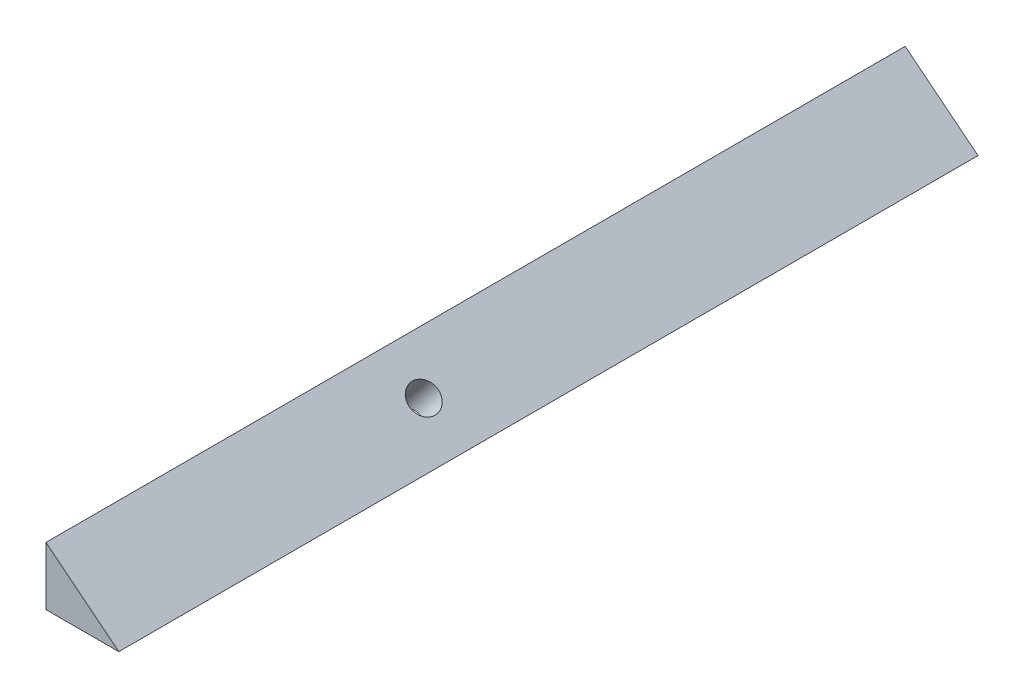
ISO-10303-21;
HEADER;
FILE_DESCRIPTION(('STEP AP214'),'2;1');
FILE_NAME('part.step','',(''),(''),'','','');
FILE_SCHEMA(('AUTOMOTIVE_DESIGN { 1 0 10303 214 1 1 1 1 }'));
ENDSEC;
DATA;
#1=APPLICATION_CONTEXT('core data for automotive mechanical design processes');
#2=APPLICATION_PROTOCOL_DEFINITION('international standard','automotive_design',2000,#1);
#3=PRODUCT_CONTEXT('',#1,'mechanical');
#4=PRODUCT('Part','Part','',(#3));
#5=PRODUCT_RELATED_PRODUCT_CATEGORY('part','',(#4));
#6=PRODUCT_DEFINITION_FORMATION('','',#4);
#7=PRODUCT_DEFINITION_CONTEXT('part definition',#1,'design');
#8=PRODUCT_DEFINITION('design','',#6,#7);
#9=PRODUCT_DEFINITION_SHAPE('','',#8);
#10=(LENGTH_UNIT() NAMED_UNIT(*) SI_UNIT(.MILLI.,.METRE.));
#11=(NAMED_UNIT(*) PLANE_ANGLE_UNIT() SI_UNIT($,.RADIAN.));
#12=(NAMED_UNIT(*) SI_UNIT($,.STERADIAN.) SOLID_ANGLE_UNIT());
#13=UNCERTAINTY_MEASURE_WITH_UNIT(LENGTH_MEASURE(1.E-05),#10,'distance_accuracy_value','');
#14=(GEOMETRIC_REPRESENTATION_CONTEXT(3) GLOBAL_UNCERTAINTY_ASSIGNED_CONTEXT((#13)) GLOBAL_UNIT_ASSIGNED_CONTEXT((#10,
#11,#12)) REPRESENTATION_CONTEXT('',''));
#15=CARTESIAN_POINT('',(0.,0.,0.));
#16=DIRECTION('',(0.,0.,1.));
#17=DIRECTION('',(1.,0.,0.));
#18=AXIS2_PLACEMENT_3D('',#15,#16,#17);
#19=CARTESIAN_POINT('',(0.,0.,-38.1));
#20=DIRECTION('',(1.,0.,0.));
#21=DIRECTION('',(0.,0.,-1.));
#22=AXIS2_PLACEMENT_3D('',#19,#20,#21);
#23=PLANE('',#22);
#24=DIRECTION('',(0.,0.,1.));
#25=VECTOR('',#24,1.);
#26=CARTESIAN_POINT('',(0.,0.,-38.1));
#27=LINE('',#26,#25);
#28=CARTESIAN_POINT('',(0.,0.,-469.9));
#29=VERTEX_POINT('',#28);
#30=CARTESIAN_POINT('',(0.,0.,-28.9364633738987));
#31=VERTEX_POINT('',#30);
#32=EDGE_CURVE('E105',#29,#31,#27,.T.);
#33=ORIENTED_EDGE('',*,*,#32,.T.);
#34=CARTESIAN_POINT('',(0.,-12.7609304133234,-19.05));
#35=DIRECTION('',(1.,0.,0.));
#36=DIRECTION('',(0.,1.,0.));
#37=AXIS2_PLACEMENT_3D('',#34,#35,#36);
#38=ELLIPSE('',#37,20.3299194538493,12.7);
#39=CARTESIAN_POINT('',(0.,0.,-9.16353662610129));
#40=VERTEX_POINT('',#39);
#41=EDGE_CURVE('E48',#31,#40,#38,.T.);
#42=ORIENTED_EDGE('',*,*,#41,.T.);
#43=CARTESIAN_POINT('',(0.,0.,279.4));
#44=VERTEX_POINT('',#43);
#45=EDGE_CURVE('E103',#40,#44,#27,.T.);
#46=ORIENTED_EDGE('',*,*,#45,.T.);
#47=DIRECTION('',(0.,-1.,0.));
#48=VECTOR('',#47,1.);
#49=CARTESIAN_POINT('',(0.,50.8,279.4));
#50=LINE('',#49,#48);
#51=CARTESIAN_POINT('',(0.,50.8,279.4));
#52=VERTEX_POINT('',#51);
#53=EDGE_CURVE('E76',#52,#44,#50,.T.);
#54=ORIENTED_EDGE('',*,*,#53,.F.);
#55=DIRECTION('',(0.,0.,1.));
#56=VECTOR('',#55,1.);
#57=CARTESIAN_POINT('',(0.,50.8,-38.1));
#58=LINE('',#57,#56);
#59=CARTESIAN_POINT('',(0.,50.8,-469.9));
#60=VERTEX_POINT('',#59);
#61=EDGE_CURVE('E43',#60,#52,#58,.T.);
#62=ORIENTED_EDGE('',*,*,#61,.F.);
#63=DIRECTION('',(0.,1.,0.));
#64=VECTOR('',#63,1.);
#65=CARTESIAN_POINT('',(0.,0.,-469.9));
#66=LINE('',#65,#64);
#67=EDGE_CURVE('E74',#29,#60,#66,.T.);
#68=ORIENTED_EDGE('',*,*,#67,.F.);
#69=EDGE_LOOP('',(#33,#42,#46,#54,#62,#68));
#70=FACE_BOUND('',#69,.T.);
#71=ADVANCED_FACE('F36',(#70),#23,.F.);
#72=CARTESIAN_POINT('',(24.7804878048781,30.9756097560976,-38.1));
#73=DIRECTION('',(0.624695047554424,0.78086880944303,0.));
#74=DIRECTION('',(-0.78086880944303,0.624695047554424,0.));
#75=AXIS2_PLACEMENT_3D('',#72,#73,#74);
#76=PLANE('',#75);
#77=CARTESIAN_POINT('',(31.0053319089383,25.9957344728494,-19.05));
#78=DIRECTION('',(0.624695047554424,0.78086880944303,0.));
#79=DIRECTION('',(-0.78086880944303,0.624695047554424,0.));
#80=AXIS2_PLACEMENT_3D('',#77,#78,#79);
#81=CIRCLE('',#80,12.7);
#82=CARTESIAN_POINT('',(21.0882980290118,33.9293615767906,-19.05));
#83=VERTEX_POINT('',#82);
#84=EDGE_CURVE('E100',#83,#83,#81,.T.);
#85=ORIENTED_EDGE('',*,*,#84,.F.);
#86=EDGE_LOOP('',(#85));
#87=FACE_BOUND('',#86,.T.);
#88=ORIENTED_EDGE('',*,*,#61,.T.);
#89=DIRECTION('',(-0.78086880944303,0.624695047554424,0.));
#90=VECTOR('',#89,1.);
#91=CARTESIAN_POINT('',(63.5,0.,279.4));
#92=LINE('',#91,#90);
#93=CARTESIAN_POINT('',(63.5,0.,279.4));
#94=VERTEX_POINT('',#93);
#95=EDGE_CURVE('E94',#94,#52,#92,.T.);
#96=ORIENTED_EDGE('',*,*,#95,.F.);
#97=DIRECTION('',(0.,0.,1.));
#98=VECTOR('',#97,1.);
#99=CARTESIAN_POINT('',(63.5,0.,-38.1));
#100=LINE('',#99,#98);
#101=CARTESIAN_POINT('',(63.5,0.,-469.9));
#102=VERTEX_POINT('',#101);
#103=EDGE_CURVE('E80',#102,#94,#100,.T.);
#104=ORIENTED_EDGE('',*,*,#103,.F.);
#105=DIRECTION('',(0.78086880944303,-0.624695047554424,0.));
#106=VECTOR('',#105,1.);
#107=CARTESIAN_POINT('',(0.,50.8,-469.9));
#108=LINE('',#107,#106);
#109=EDGE_CURVE('E83',#60,#102,#108,.T.);
#110=ORIENTED_EDGE('',*,*,#109,.F.);
#111=EDGE_LOOP('',(#88,#96,#104,#110));
#112=FACE_BOUND('',#111,.T.);
#113=ADVANCED_FACE('F84',(#87,#112),#76,.T.);
#114=CARTESIAN_POINT('',(0.,0.,-38.1));
#115=DIRECTION('',(0.,-1.,0.));
#116=DIRECTION('',(0.,0.,-1.));
#117=AXIS2_PLACEMENT_3D('',#114,#115,#116);
#118=PLANE('',#117);
#119=CARTESIAN_POINT('',(10.2087443306587,0.,-19.05));
#120=DIRECTION('',(0.,-1.,0.));
#121=DIRECTION('',(1.,0.,0.));
#122=AXIS2_PLACEMENT_3D('',#119,#120,#121);
#123=ELLIPSE('',#122,16.2639355630794,12.7);
#124=EDGE_CURVE('E11',#31,#40,#123,.T.);
#125=ORIENTED_EDGE('',*,*,#124,.F.);
#126=ORIENTED_EDGE('',*,*,#32,.F.);
#127=DIRECTION('',(-1.,0.,0.));
#128=VECTOR('',#127,1.);
#129=CARTESIAN_POINT('',(63.5,0.,-469.9));
#130=LINE('',#129,#128);
#131=EDGE_CURVE('E88',#102,#29,#130,.T.);
#132=ORIENTED_EDGE('',*,*,#131,.F.);
#133=ORIENTED_EDGE('',*,*,#103,.T.);
#134=DIRECTION('',(1.,0.,0.));
#135=VECTOR('',#134,1.);
#136=CARTESIAN_POINT('',(0.,0.,279.4));
#137=LINE('',#136,#135);
#138=EDGE_CURVE('E97',#44,#94,#137,.T.);
#139=ORIENTED_EDGE('',*,*,#138,.F.);
#140=ORIENTED_EDGE('',*,*,#45,.F.);
#141=EDGE_LOOP('',(#125,#126,#132,#133,#139,#140));
#142=FACE_BOUND('',#141,.T.);
#143=ADVANCED_FACE('F111',(#142),#118,.T.);
#144=CARTESIAN_POINT('',(6.2248441040602,-4.97987528324817,-19.05));
#145=DIRECTION('',(0.624695047554424,0.78086880944303,0.));
#146=DIRECTION('',(-0.78086880944303,0.624695047554424,0.));
#147=AXIS2_PLACEMENT_3D('',#144,#145,#146);
#148=CYLINDRICAL_SURFACE('',#147,12.7);
#149=ORIENTED_EDGE('',*,*,#84,.T.);
#150=EDGE_LOOP('',(#149));
#151=FACE_BOUND('',#150,.T.);
#152=ORIENTED_EDGE('',*,*,#124,.T.);
#153=ORIENTED_EDGE('',*,*,#41,.F.);
#154=EDGE_LOOP('',(#152,#153));
#155=FACE_BOUND('',#154,.T.);
#156=ADVANCED_FACE('F113',(#151,#155),#148,.F.);
#157=CARTESIAN_POINT('',(0.,0.,279.4));
#158=DIRECTION('',(0.,0.,1.));
#159=DIRECTION('',(1.,0.,0.));
#160=AXIS2_PLACEMENT_3D('',#157,#158,#159);
#161=PLANE('',#160);
#162=ORIENTED_EDGE('',*,*,#95,.T.);
#163=ORIENTED_EDGE('',*,*,#53,.T.);
#164=ORIENTED_EDGE('',*,*,#138,.T.);
#165=EDGE_LOOP('',(#162,#163,#164));
#166=FACE_BOUND('',#165,.T.);
#167=ADVANCED_FACE('F110',(#166),#161,.T.);
#168=CARTESIAN_POINT('',(0.,0.,-469.9));
#169=DIRECTION('',(0.,0.,1.));
#170=DIRECTION('',(1.,0.,0.));
#171=AXIS2_PLACEMENT_3D('',#168,#169,#170);
#172=PLANE('',#171);
#173=ORIENTED_EDGE('',*,*,#67,.T.);
#174=ORIENTED_EDGE('',*,*,#109,.T.);
#175=ORIENTED_EDGE('',*,*,#131,.T.);
#176=EDGE_LOOP('',(#173,#174,#175));
#177=FACE_BOUND('',#176,.T.);
#178=ADVANCED_FACE('F90',(#177),#172,.F.);
#179=CLOSED_SHELL('',(#71,#113,#143,#156,#167,#178));
#180=MANIFOLD_SOLID_BREP('B2',#179);
#181=ADVANCED_BREP_SHAPE_REPRESENTATION('',(#18,#180),#14);
#182=SHAPE_DEFINITION_REPRESENTATION(#9,#181);
ENDSEC;
END-ISO-10303-21;
